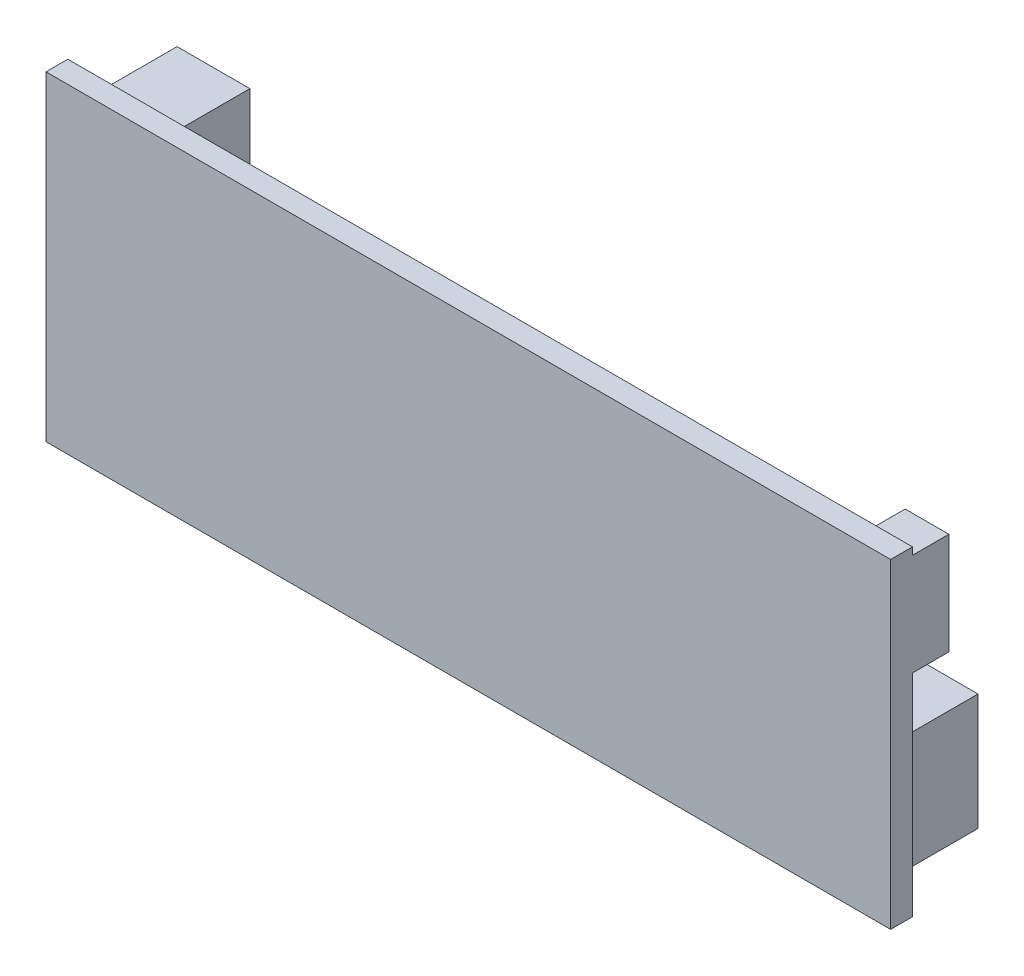
ISO-10303-21;
HEADER;
FILE_DESCRIPTION(('STEP AP214'),'2;1');
FILE_NAME('part.step','',(''),(''),'','','');
FILE_SCHEMA(('AUTOMOTIVE_DESIGN { 1 0 10303 214 1 1 1 1 }'));
ENDSEC;
DATA;
#1=APPLICATION_CONTEXT('core data for automotive mechanical design processes');
#2=APPLICATION_PROTOCOL_DEFINITION('international standard','automotive_design',2000,#1);
#3=PRODUCT_CONTEXT('',#1,'mechanical');
#4=PRODUCT('Part','Part','',(#3));
#5=PRODUCT_RELATED_PRODUCT_CATEGORY('part','',(#4));
#6=PRODUCT_DEFINITION_FORMATION('','',#4);
#7=PRODUCT_DEFINITION_CONTEXT('part definition',#1,'design');
#8=PRODUCT_DEFINITION('design','',#6,#7);
#9=PRODUCT_DEFINITION_SHAPE('','',#8);
#10=(LENGTH_UNIT() NAMED_UNIT(*) SI_UNIT(.MILLI.,.METRE.));
#11=(NAMED_UNIT(*) PLANE_ANGLE_UNIT() SI_UNIT($,.RADIAN.));
#12=(NAMED_UNIT(*) SI_UNIT($,.STERADIAN.) SOLID_ANGLE_UNIT());
#13=UNCERTAINTY_MEASURE_WITH_UNIT(LENGTH_MEASURE(1.E-05),#10,'distance_accuracy_value','');
#14=(GEOMETRIC_REPRESENTATION_CONTEXT(3) GLOBAL_UNCERTAINTY_ASSIGNED_CONTEXT((#13)) GLOBAL_UNIT_ASSIGNED_CONTEXT((#10,
#11,#12)) REPRESENTATION_CONTEXT('',''));
#15=CARTESIAN_POINT('',(0.,0.,0.));
#16=DIRECTION('',(0.,0.,1.));
#17=DIRECTION('',(1.,0.,0.));
#18=AXIS2_PLACEMENT_3D('',#15,#16,#17);
#19=CARTESIAN_POINT('',(0.,0.,0.));
#20=DIRECTION('',(0.,0.,-1.));
#21=DIRECTION('',(-1.,0.,0.));
#22=AXIS2_PLACEMENT_3D('',#19,#20,#21);
#23=PLANE('',#22);
#24=DIRECTION('',(1.,0.,0.));
#25=VECTOR('',#24,1.);
#26=CARTESIAN_POINT('',(-17.781512605042,20.5,0.));
#27=LINE('',#26,#25);
#28=CARTESIAN_POINT('',(-17.781512605042,20.5,0.));
#29=VERTEX_POINT('',#28);
#30=CARTESIAN_POINT('',(-12.781512605042,20.5,0.));
#31=VERTEX_POINT('',#30);
#32=EDGE_CURVE('E276',#29,#31,#27,.T.);
#33=ORIENTED_EDGE('',*,*,#32,.F.);
#34=DIRECTION('',(0.,1.,0.));
#35=VECTOR('',#34,1.);
#36=CARTESIAN_POINT('',(-17.781512605042,20.5,0.));
#37=LINE('',#36,#35);
#38=CARTESIAN_POINT('',(-17.781512605042,15.5,0.));
#39=VERTEX_POINT('',#38);
#40=EDGE_CURVE('E273',#39,#29,#37,.T.);
#41=ORIENTED_EDGE('',*,*,#40,.F.);
#42=DIRECTION('',(-1.,0.,0.));
#43=VECTOR('',#42,1.);
#44=CARTESIAN_POINT('',(-17.781512605042,15.5,0.));
#45=LINE('',#44,#43);
#46=CARTESIAN_POINT('',(-12.781512605042,15.5,0.));
#47=VERTEX_POINT('',#46);
#48=EDGE_CURVE('E281',#47,#39,#45,.T.);
#49=ORIENTED_EDGE('',*,*,#48,.F.);
#50=DIRECTION('',(0.,-1.,0.));
#51=VECTOR('',#50,1.);
#52=CARTESIAN_POINT('',(-12.781512605042,20.5,0.));
#53=LINE('',#52,#51);
#54=EDGE_CURVE('E278',#31,#47,#53,.T.);
#55=ORIENTED_EDGE('',*,*,#54,.F.);
#56=EDGE_LOOP('',(#33,#41,#49,#55));
#57=FACE_BOUND('',#56,.T.);
#58=DIRECTION('',(-1.,0.,0.));
#59=VECTOR('',#58,1.);
#60=CARTESIAN_POINT('',(37.218487394958,1.5,0.));
#61=LINE('',#60,#59);
#62=CARTESIAN_POINT('',(37.218487394958,1.5,0.));
#63=VERTEX_POINT('',#62);
#64=CARTESIAN_POINT('',(29.218487394958,1.5,0.));
#65=VERTEX_POINT('',#64);
#66=EDGE_CURVE('E237',#63,#65,#61,.T.);
#67=ORIENTED_EDGE('',*,*,#66,.F.);
#68=DIRECTION('',(0.,-1.,0.));
#69=VECTOR('',#68,1.);
#70=CARTESIAN_POINT('',(37.218487394958,1.5,0.));
#71=LINE('',#70,#69);
#72=CARTESIAN_POINT('',(37.218487394958,9.5,0.));
#73=VERTEX_POINT('',#72);
#74=EDGE_CURVE('E235',#73,#63,#71,.T.);
#75=ORIENTED_EDGE('',*,*,#74,.F.);
#76=DIRECTION('',(1.,0.,0.));
#77=VECTOR('',#76,1.);
#78=CARTESIAN_POINT('',(37.218487394958,9.5,0.));
#79=LINE('',#78,#77);
#80=CARTESIAN_POINT('',(29.218487394958,9.5,0.));
#81=VERTEX_POINT('',#80);
#82=EDGE_CURVE('E174',#81,#73,#79,.T.);
#83=ORIENTED_EDGE('',*,*,#82,.F.);
#84=DIRECTION('',(0.,1.,0.));
#85=VECTOR('',#84,1.);
#86=CARTESIAN_POINT('',(29.218487394958,1.5,0.));
#87=LINE('',#86,#85);
#88=EDGE_CURVE('E239',#65,#81,#87,.T.);
#89=ORIENTED_EDGE('',*,*,#88,.F.);
#90=EDGE_LOOP('',(#67,#75,#83,#89));
#91=FACE_BOUND('',#90,.T.);
#92=DIRECTION('',(0.,-1.,0.));
#93=VECTOR('',#92,1.);
#94=CARTESIAN_POINT('',(-19.281512605042,22.,0.));
#95=LINE('',#94,#93);
#96=CARTESIAN_POINT('',(-19.281512605042,3.09786204051446,0.));
#97=VERTEX_POINT('',#96);
#98=CARTESIAN_POINT('',(-19.281512605042,0.,0.));
#99=VERTEX_POINT('',#98);
#100=EDGE_CURVE('E307',#97,#99,#95,.T.);
#101=ORIENTED_EDGE('',*,*,#100,.F.);
#102=DIRECTION('',(-1.,0.,0.));
#103=VECTOR('',#102,1.);
#104=CARTESIAN_POINT('',(-17.781512605042,3.09786204051446,0.));
#105=LINE('',#104,#103);
#106=CARTESIAN_POINT('',(-17.781512605042,3.09786204051446,0.));
#107=VERTEX_POINT('',#106);
#108=EDGE_CURVE('E223',#107,#97,#105,.T.);
#109=ORIENTED_EDGE('',*,*,#108,.F.);
#110=DIRECTION('',(0.,-1.,0.));
#111=VECTOR('',#110,1.);
#112=CARTESIAN_POINT('',(-17.781512605042,7.9,0.));
#113=LINE('',#112,#111);
#114=CARTESIAN_POINT('',(-17.781512605042,7.9,0.));
#115=VERTEX_POINT('',#114);
#116=EDGE_CURVE('E220',#115,#107,#113,.T.);
#117=ORIENTED_EDGE('',*,*,#116,.F.);
#118=DIRECTION('',(1.,0.,0.));
#119=VECTOR('',#118,1.);
#120=CARTESIAN_POINT('',(-17.781512605042,7.9,0.));
#121=LINE('',#120,#119);
#122=CARTESIAN_POINT('',(-19.281512605042,7.9,0.));
#123=VERTEX_POINT('',#122);
#124=EDGE_CURVE('E225',#123,#115,#121,.T.);
#125=ORIENTED_EDGE('',*,*,#124,.F.);
#126=CARTESIAN_POINT('',(-19.281512605042,22.,0.));
#127=VERTEX_POINT('',#126);
#128=EDGE_CURVE('E308',#127,#123,#95,.T.);
#129=ORIENTED_EDGE('',*,*,#128,.F.);
#130=DIRECTION('',(-1.,0.,0.));
#131=VECTOR('',#130,1.);
#132=CARTESIAN_POINT('',(-19.281512605042,22.,0.));
#133=LINE('',#132,#131);
#134=CARTESIAN_POINT('',(38.718487394958,22.,0.));
#135=VERTEX_POINT('',#134);
#136=EDGE_CURVE('E293',#135,#127,#133,.T.);
#137=ORIENTED_EDGE('',*,*,#136,.F.);
#138=DIRECTION('',(0.,1.,0.));
#139=VECTOR('',#138,1.);
#140=CARTESIAN_POINT('',(38.718487394958,22.,0.));
#141=LINE('',#140,#139);
#142=CARTESIAN_POINT('',(38.718487394958,21.5,0.));
#143=VERTEX_POINT('',#142);
#144=EDGE_CURVE('E313',#143,#135,#141,.T.);
#145=ORIENTED_EDGE('',*,*,#144,.F.);
#146=DIRECTION('',(1.,0.,0.));
#147=VECTOR('',#146,1.);
#148=CARTESIAN_POINT('',(38.718487394958,21.5,0.));
#149=LINE('',#148,#147);
#150=CARTESIAN_POINT('',(35.718487394958,21.5,0.));
#151=VERTEX_POINT('',#150);
#152=EDGE_CURVE('E252',#151,#143,#149,.T.);
#153=ORIENTED_EDGE('',*,*,#152,.F.);
#154=DIRECTION('',(0.,1.,0.));
#155=VECTOR('',#154,1.);
#156=CARTESIAN_POINT('',(35.718487394958,21.5,0.));
#157=LINE('',#156,#155);
#158=CARTESIAN_POINT('',(35.718487394958,14.5,0.));
#159=VERTEX_POINT('',#158);
#160=EDGE_CURVE('E260',#159,#151,#157,.T.);
#161=ORIENTED_EDGE('',*,*,#160,.F.);
#162=DIRECTION('',(-1.,0.,0.));
#163=VECTOR('',#162,1.);
#164=CARTESIAN_POINT('',(38.718487394958,14.5,0.));
#165=LINE('',#164,#163);
#166=CARTESIAN_POINT('',(38.718487394958,14.5,0.));
#167=VERTEX_POINT('',#166);
#168=EDGE_CURVE('E247',#167,#159,#165,.T.);
#169=ORIENTED_EDGE('',*,*,#168,.F.);
#170=CARTESIAN_POINT('',(38.718487394958,0.,0.));
#171=VERTEX_POINT('',#170);
#172=EDGE_CURVE('E298',#171,#167,#141,.T.);
#173=ORIENTED_EDGE('',*,*,#172,.F.);
#174=DIRECTION('',(1.,0.,0.));
#175=VECTOR('',#174,1.);
#176=CARTESIAN_POINT('',(38.718487394958,0.,0.));
#177=LINE('',#176,#175);
#178=EDGE_CURVE('E311',#99,#171,#177,.T.);
#179=ORIENTED_EDGE('',*,*,#178,.F.);
#180=EDGE_LOOP('',(#101,#109,#117,#125,#129,#137,#145,#153,#161,#169,#173,#179));
#181=FACE_BOUND('',#180,.T.);
#182=ADVANCED_FACE('F33',(#57,#91,#181),#23,.T.);
#183=CARTESIAN_POINT('',(-19.281512605042,22.,1.5));
#184=DIRECTION('',(0.,-1.,0.));
#185=DIRECTION('',(0.,0.,-1.));
#186=AXIS2_PLACEMENT_3D('',#183,#184,#185);
#187=PLANE('',#186);
#188=ORIENTED_EDGE('',*,*,#136,.T.);
#189=DIRECTION('',(0.,0.,-1.));
#190=VECTOR('',#189,1.);
#191=CARTESIAN_POINT('',(-19.281512605042,22.,1.5));
#192=LINE('',#191,#190);
#193=CARTESIAN_POINT('',(-19.281512605042,22.,1.5));
#194=VERTEX_POINT('',#193);
#195=EDGE_CURVE('E11',#194,#127,#192,.T.);
#196=ORIENTED_EDGE('',*,*,#195,.F.);
#197=DIRECTION('',(-1.,0.,0.));
#198=VECTOR('',#197,1.);
#199=CARTESIAN_POINT('',(-19.281512605042,22.,1.5));
#200=LINE('',#199,#198);
#201=CARTESIAN_POINT('',(38.718487394958,22.,1.5));
#202=VERTEX_POINT('',#201);
#203=EDGE_CURVE('E294',#202,#194,#200,.T.);
#204=ORIENTED_EDGE('',*,*,#203,.F.);
#205=DIRECTION('',(0.,0.,-1.));
#206=VECTOR('',#205,1.);
#207=CARTESIAN_POINT('',(38.718487394958,22.,1.5));
#208=LINE('',#207,#206);
#209=EDGE_CURVE('E304',#202,#135,#208,.T.);
#210=ORIENTED_EDGE('',*,*,#209,.T.);
#211=EDGE_LOOP('',(#188,#196,#204,#210));
#212=FACE_BOUND('',#211,.T.);
#213=ADVANCED_FACE('F35',(#212),#187,.F.);
#214=CARTESIAN_POINT('',(-19.281512605042,22.,1.5));
#215=DIRECTION('',(1.,0.,0.));
#216=DIRECTION('',(0.,0.,-1.));
#217=AXIS2_PLACEMENT_3D('',#214,#215,#216);
#218=PLANE('',#217);
#219=ORIENTED_EDGE('',*,*,#128,.T.);
#220=DIRECTION('',(0.,0.,1.));
#221=VECTOR('',#220,1.);
#222=CARTESIAN_POINT('',(-19.281512605042,7.9,-2.5));
#223=LINE('',#222,#221);
#224=CARTESIAN_POINT('',(-19.281512605042,7.9,-6.));
#225=VERTEX_POINT('',#224);
#226=EDGE_CURVE('E230',#225,#123,#223,.T.);
#227=ORIENTED_EDGE('',*,*,#226,.F.);
#228=DIRECTION('',(0.,1.,0.));
#229=VECTOR('',#228,1.);
#230=CARTESIAN_POINT('',(-19.281512605042,3.09786204051446,-6.));
#231=LINE('',#230,#229);
#232=CARTESIAN_POINT('',(-19.281512605042,3.09786204051446,-6.));
#233=VERTEX_POINT('',#232);
#234=EDGE_CURVE('E217',#233,#225,#231,.T.);
#235=ORIENTED_EDGE('',*,*,#234,.F.);
#236=DIRECTION('',(0.,0.,1.));
#237=VECTOR('',#236,1.);
#238=CARTESIAN_POINT('',(-19.281512605042,3.09786204051446,-2.5));
#239=LINE('',#238,#237);
#240=EDGE_CURVE('E48',#233,#97,#239,.T.);
#241=ORIENTED_EDGE('',*,*,#240,.T.);
#242=ORIENTED_EDGE('',*,*,#100,.T.);
#243=DIRECTION('',(0.,0.,-1.));
#244=VECTOR('',#243,1.);
#245=CARTESIAN_POINT('',(-19.281512605042,0.,1.5));
#246=LINE('',#245,#244);
#247=CARTESIAN_POINT('',(-19.281512605042,0.,1.5));
#248=VERTEX_POINT('',#247);
#249=EDGE_CURVE('E41',#248,#99,#246,.T.);
#250=ORIENTED_EDGE('',*,*,#249,.F.);
#251=DIRECTION('',(0.,-1.,0.));
#252=VECTOR('',#251,1.);
#253=CARTESIAN_POINT('',(-19.281512605042,22.,1.5));
#254=LINE('',#253,#252);
#255=EDGE_CURVE('E297',#194,#248,#254,.T.);
#256=ORIENTED_EDGE('',*,*,#255,.F.);
#257=ORIENTED_EDGE('',*,*,#195,.T.);
#258=EDGE_LOOP('',(#219,#227,#235,#241,#242,#250,#256,#257));
#259=FACE_BOUND('',#258,.T.);
#260=ADVANCED_FACE('F343',(#259),#218,.F.);
#261=CARTESIAN_POINT('',(38.718487394958,0.,1.5));
#262=DIRECTION('',(0.,1.,0.));
#263=DIRECTION('',(0.,0.,1.));
#264=AXIS2_PLACEMENT_3D('',#261,#262,#263);
#265=PLANE('',#264);
#266=ORIENTED_EDGE('',*,*,#178,.T.);
#267=DIRECTION('',(0.,0.,-1.));
#268=VECTOR('',#267,1.);
#269=CARTESIAN_POINT('',(38.718487394958,0.,1.5));
#270=LINE('',#269,#268);
#271=CARTESIAN_POINT('',(38.718487394958,0.,1.5));
#272=VERTEX_POINT('',#271);
#273=EDGE_CURVE('E318',#272,#171,#270,.T.);
#274=ORIENTED_EDGE('',*,*,#273,.F.);
#275=DIRECTION('',(1.,0.,0.));
#276=VECTOR('',#275,1.);
#277=CARTESIAN_POINT('',(38.718487394958,0.,1.5));
#278=LINE('',#277,#276);
#279=EDGE_CURVE('E300',#248,#272,#278,.T.);
#280=ORIENTED_EDGE('',*,*,#279,.F.);
#281=ORIENTED_EDGE('',*,*,#249,.T.);
#282=EDGE_LOOP('',(#266,#274,#280,#281));
#283=FACE_BOUND('',#282,.T.);
#284=ADVANCED_FACE('F325',(#283),#265,.F.);
#285=CARTESIAN_POINT('',(38.718487394958,22.,1.5));
#286=DIRECTION('',(-1.,0.,0.));
#287=DIRECTION('',(0.,0.,1.));
#288=AXIS2_PLACEMENT_3D('',#285,#286,#287);
#289=PLANE('',#288);
#290=ORIENTED_EDGE('',*,*,#172,.T.);
#291=DIRECTION('',(0.,0.,1.));
#292=VECTOR('',#291,1.);
#293=CARTESIAN_POINT('',(38.718487394958,14.5,-2.5));
#294=LINE('',#293,#292);
#295=CARTESIAN_POINT('',(38.718487394958,14.5,-2.5));
#296=VERTEX_POINT('',#295);
#297=EDGE_CURVE('E271',#296,#167,#294,.T.);
#298=ORIENTED_EDGE('',*,*,#297,.F.);
#299=DIRECTION('',(0.,-1.,0.));
#300=VECTOR('',#299,1.);
#301=CARTESIAN_POINT('',(38.718487394958,21.5,-2.5));
#302=LINE('',#301,#300);
#303=CARTESIAN_POINT('',(38.718487394958,21.5,-2.5));
#304=VERTEX_POINT('',#303);
#305=EDGE_CURVE('E248',#304,#296,#302,.T.);
#306=ORIENTED_EDGE('',*,*,#305,.F.);
#307=DIRECTION('',(0.,0.,1.));
#308=VECTOR('',#307,1.);
#309=CARTESIAN_POINT('',(38.718487394958,21.5,-2.5));
#310=LINE('',#309,#308);
#311=EDGE_CURVE('E258',#304,#143,#310,.T.);
#312=ORIENTED_EDGE('',*,*,#311,.T.);
#313=ORIENTED_EDGE('',*,*,#144,.T.);
#314=ORIENTED_EDGE('',*,*,#209,.F.);
#315=DIRECTION('',(0.,1.,0.));
#316=VECTOR('',#315,1.);
#317=CARTESIAN_POINT('',(38.718487394958,22.,1.5));
#318=LINE('',#317,#316);
#319=EDGE_CURVE('E302',#272,#202,#318,.T.);
#320=ORIENTED_EDGE('',*,*,#319,.F.);
#321=ORIENTED_EDGE('',*,*,#273,.T.);
#322=EDGE_LOOP('',(#290,#298,#306,#312,#313,#314,#320,#321));
#323=FACE_BOUND('',#322,.T.);
#324=ADVANCED_FACE('F335',(#323),#289,.F.);
#325=CARTESIAN_POINT('',(0.,0.,1.5));
#326=DIRECTION('',(0.,0.,-1.));
#327=DIRECTION('',(-1.,0.,0.));
#328=AXIS2_PLACEMENT_3D('',#325,#326,#327);
#329=PLANE('',#328);
#330=ORIENTED_EDGE('',*,*,#203,.T.);
#331=ORIENTED_EDGE('',*,*,#255,.T.);
#332=ORIENTED_EDGE('',*,*,#279,.T.);
#333=ORIENTED_EDGE('',*,*,#319,.T.);
#334=EDGE_LOOP('',(#330,#331,#332,#333));
#335=FACE_BOUND('',#334,.T.);
#336=ADVANCED_FACE('F341',(#335),#329,.F.);
#337=CARTESIAN_POINT('',(-17.781512605042,20.5,-2.5));
#338=DIRECTION('',(1.,0.,0.));
#339=DIRECTION('',(0.,0.,-1.));
#340=AXIS2_PLACEMENT_3D('',#337,#338,#339);
#341=PLANE('',#340);
#342=ORIENTED_EDGE('',*,*,#40,.T.);
#343=DIRECTION('',(0.,0.,1.));
#344=VECTOR('',#343,1.);
#345=CARTESIAN_POINT('',(-17.781512605042,20.5,-2.5));
#346=LINE('',#345,#344);
#347=CARTESIAN_POINT('',(-17.781512605042,20.5,-6.));
#348=VERTEX_POINT('',#347);
#349=EDGE_CURVE('E291',#348,#29,#346,.T.);
#350=ORIENTED_EDGE('',*,*,#349,.F.);
#351=DIRECTION('',(0.,1.,0.));
#352=VECTOR('',#351,1.);
#353=CARTESIAN_POINT('',(-17.781512605042,15.5,-6.));
#354=LINE('',#353,#352);
#355=CARTESIAN_POINT('',(-17.781512605042,15.5,-6.));
#356=VERTEX_POINT('',#355);
#357=EDGE_CURVE('E199',#356,#348,#354,.T.);
#358=ORIENTED_EDGE('',*,*,#357,.F.);
#359=DIRECTION('',(0.,0.,1.));
#360=VECTOR('',#359,1.);
#361=CARTESIAN_POINT('',(-17.781512605042,15.5,-2.5));
#362=LINE('',#361,#360);
#363=EDGE_CURVE('E283',#356,#39,#362,.T.);
#364=ORIENTED_EDGE('',*,*,#363,.T.);
#365=EDGE_LOOP('',(#342,#350,#358,#364));
#366=FACE_BOUND('',#365,.T.);
#367=ADVANCED_FACE('F395',(#366),#341,.F.);
#368=CARTESIAN_POINT('',(-17.781512605042,20.5,-2.5));
#369=DIRECTION('',(0.,-1.,0.));
#370=DIRECTION('',(0.,0.,-1.));
#371=AXIS2_PLACEMENT_3D('',#368,#369,#370);
#372=PLANE('',#371);
#373=ORIENTED_EDGE('',*,*,#32,.T.);
#374=DIRECTION('',(0.,0.,1.));
#375=VECTOR('',#374,1.);
#376=CARTESIAN_POINT('',(-12.781512605042,20.5,-2.5));
#377=LINE('',#376,#375);
#378=CARTESIAN_POINT('',(-12.781512605042,20.5,-6.));
#379=VERTEX_POINT('',#378);
#380=EDGE_CURVE('E288',#379,#31,#377,.T.);
#381=ORIENTED_EDGE('',*,*,#380,.F.);
#382=DIRECTION('',(1.,0.,0.));
#383=VECTOR('',#382,1.);
#384=CARTESIAN_POINT('',(-17.781512605042,20.5,-6.));
#385=LINE('',#384,#383);
#386=EDGE_CURVE('E202',#348,#379,#385,.T.);
#387=ORIENTED_EDGE('',*,*,#386,.F.);
#388=ORIENTED_EDGE('',*,*,#349,.T.);
#389=EDGE_LOOP('',(#373,#381,#387,#388));
#390=FACE_BOUND('',#389,.T.);
#391=ADVANCED_FACE('F398',(#390),#372,.F.);
#392=CARTESIAN_POINT('',(-12.781512605042,20.5,-2.5));
#393=DIRECTION('',(-1.,0.,0.));
#394=DIRECTION('',(0.,0.,1.));
#395=AXIS2_PLACEMENT_3D('',#392,#393,#394);
#396=PLANE('',#395);
#397=ORIENTED_EDGE('',*,*,#54,.T.);
#398=DIRECTION('',(0.,0.,1.));
#399=VECTOR('',#398,1.);
#400=CARTESIAN_POINT('',(-12.781512605042,15.5,-2.5));
#401=LINE('',#400,#399);
#402=CARTESIAN_POINT('',(-12.781512605042,15.5,-6.));
#403=VERTEX_POINT('',#402);
#404=EDGE_CURVE('E286',#403,#47,#401,.T.);
#405=ORIENTED_EDGE('',*,*,#404,.F.);
#406=DIRECTION('',(0.,-1.,0.));
#407=VECTOR('',#406,1.);
#408=CARTESIAN_POINT('',(-12.781512605042,20.5,-6.));
#409=LINE('',#408,#407);
#410=EDGE_CURVE('E205',#379,#403,#409,.T.);
#411=ORIENTED_EDGE('',*,*,#410,.F.);
#412=ORIENTED_EDGE('',*,*,#380,.T.);
#413=EDGE_LOOP('',(#397,#405,#411,#412));
#414=FACE_BOUND('',#413,.T.);
#415=ADVANCED_FACE('F405',(#414),#396,.F.);
#416=CARTESIAN_POINT('',(-17.781512605042,15.5,-2.5));
#417=DIRECTION('',(0.,1.,0.));
#418=DIRECTION('',(0.,0.,1.));
#419=AXIS2_PLACEMENT_3D('',#416,#417,#418);
#420=PLANE('',#419);
#421=ORIENTED_EDGE('',*,*,#48,.T.);
#422=ORIENTED_EDGE('',*,*,#363,.F.);
#423=DIRECTION('',(-1.,0.,0.));
#424=VECTOR('',#423,1.);
#425=CARTESIAN_POINT('',(-12.781512605042,15.5,-6.));
#426=LINE('',#425,#424);
#427=EDGE_CURVE('E196',#403,#356,#426,.T.);
#428=ORIENTED_EDGE('',*,*,#427,.F.);
#429=ORIENTED_EDGE('',*,*,#404,.T.);
#430=EDGE_LOOP('',(#421,#422,#428,#429));
#431=FACE_BOUND('',#430,.T.);
#432=ADVANCED_FACE('F413',(#431),#420,.F.);
#433=CARTESIAN_POINT('',(38.718487394958,14.5,-2.5));
#434=DIRECTION('',(0.,1.,0.));
#435=DIRECTION('',(0.,0.,1.));
#436=AXIS2_PLACEMENT_3D('',#433,#434,#435);
#437=PLANE('',#436);
#438=ORIENTED_EDGE('',*,*,#168,.T.);
#439=DIRECTION('',(0.,0.,1.));
#440=VECTOR('',#439,1.);
#441=CARTESIAN_POINT('',(35.718487394958,14.5,-2.5));
#442=LINE('',#441,#440);
#443=CARTESIAN_POINT('',(35.718487394958,14.5,-2.5));
#444=VERTEX_POINT('',#443);
#445=EDGE_CURVE('E268',#444,#159,#442,.T.);
#446=ORIENTED_EDGE('',*,*,#445,.F.);
#447=DIRECTION('',(-1.,0.,0.));
#448=VECTOR('',#447,1.);
#449=CARTESIAN_POINT('',(38.718487394958,14.5,-2.5));
#450=LINE('',#449,#448);
#451=EDGE_CURVE('E251',#296,#444,#450,.T.);
#452=ORIENTED_EDGE('',*,*,#451,.F.);
#453=ORIENTED_EDGE('',*,*,#297,.T.);
#454=EDGE_LOOP('',(#438,#446,#452,#453));
#455=FACE_BOUND('',#454,.T.);
#456=ADVANCED_FACE('F421',(#455),#437,.F.);
#457=CARTESIAN_POINT('',(35.718487394958,21.5,-2.5));
#458=DIRECTION('',(1.,0.,0.));
#459=DIRECTION('',(0.,0.,-1.));
#460=AXIS2_PLACEMENT_3D('',#457,#458,#459);
#461=PLANE('',#460);
#462=ORIENTED_EDGE('',*,*,#160,.T.);
#463=DIRECTION('',(0.,0.,1.));
#464=VECTOR('',#463,1.);
#465=CARTESIAN_POINT('',(35.718487394958,21.5,-2.5));
#466=LINE('',#465,#464);
#467=CARTESIAN_POINT('',(35.718487394958,21.5,-2.5));
#468=VERTEX_POINT('',#467);
#469=EDGE_CURVE('E265',#468,#151,#466,.T.);
#470=ORIENTED_EDGE('',*,*,#469,.F.);
#471=DIRECTION('',(0.,1.,0.));
#472=VECTOR('',#471,1.);
#473=CARTESIAN_POINT('',(35.718487394958,21.5,-2.5));
#474=LINE('',#473,#472);
#475=EDGE_CURVE('E254',#444,#468,#474,.T.);
#476=ORIENTED_EDGE('',*,*,#475,.F.);
#477=ORIENTED_EDGE('',*,*,#445,.T.);
#478=EDGE_LOOP('',(#462,#470,#476,#477));
#479=FACE_BOUND('',#478,.T.);
#480=ADVANCED_FACE('F572',(#479),#461,.F.);
#481=CARTESIAN_POINT('',(38.718487394958,21.5,-2.5));
#482=DIRECTION('',(0.,-1.,0.));
#483=DIRECTION('',(0.,0.,-1.));
#484=AXIS2_PLACEMENT_3D('',#481,#482,#483);
#485=PLANE('',#484);
#486=ORIENTED_EDGE('',*,*,#152,.T.);
#487=ORIENTED_EDGE('',*,*,#311,.F.);
#488=DIRECTION('',(1.,0.,0.));
#489=VECTOR('',#488,1.);
#490=CARTESIAN_POINT('',(38.718487394958,21.5,-2.5));
#491=LINE('',#490,#489);
#492=EDGE_CURVE('E256',#468,#304,#491,.T.);
#493=ORIENTED_EDGE('',*,*,#492,.F.);
#494=ORIENTED_EDGE('',*,*,#469,.T.);
#495=EDGE_LOOP('',(#486,#487,#493,#494));
#496=FACE_BOUND('',#495,.T.);
#497=ADVANCED_FACE('F564',(#496),#485,.F.);
#498=CARTESIAN_POINT('',(0.,0.,-2.5));
#499=DIRECTION('',(0.,0.,-1.));
#500=DIRECTION('',(-1.,0.,0.));
#501=AXIS2_PLACEMENT_3D('',#498,#499,#500);
#502=PLANE('',#501);
#503=ORIENTED_EDGE('',*,*,#305,.T.);
#504=ORIENTED_EDGE('',*,*,#451,.T.);
#505=ORIENTED_EDGE('',*,*,#475,.T.);
#506=ORIENTED_EDGE('',*,*,#492,.T.);
#507=EDGE_LOOP('',(#503,#504,#505,#506));
#508=FACE_BOUND('',#507,.T.);
#509=ADVANCED_FACE('F392',(#508),#502,.T.);
#510=CARTESIAN_POINT('',(37.218487394958,1.5,-2.5));
#511=DIRECTION('',(-1.,0.,0.));
#512=DIRECTION('',(0.,0.,1.));
#513=AXIS2_PLACEMENT_3D('',#510,#511,#512);
#514=PLANE('',#513);
#515=ORIENTED_EDGE('',*,*,#74,.T.);
#516=DIRECTION('',(0.,0.,1.));
#517=VECTOR('',#516,1.);
#518=CARTESIAN_POINT('',(37.218487394958,1.5,-2.5));
#519=LINE('',#518,#517);
#520=CARTESIAN_POINT('',(37.218487394958,1.5,-6.));
#521=VERTEX_POINT('',#520);
#522=EDGE_CURVE('E182',#521,#63,#519,.T.);
#523=ORIENTED_EDGE('',*,*,#522,.F.);
#524=DIRECTION('',(0.,-1.,0.));
#525=VECTOR('',#524,1.);
#526=CARTESIAN_POINT('',(37.218487394958,9.5,-6.));
#527=LINE('',#526,#525);
#528=CARTESIAN_POINT('',(37.218487394958,9.5,-6.));
#529=VERTEX_POINT('',#528);
#530=EDGE_CURVE('E180',#529,#521,#527,.T.);
#531=ORIENTED_EDGE('',*,*,#530,.F.);
#532=DIRECTION('',(0.,0.,1.));
#533=VECTOR('',#532,1.);
#534=CARTESIAN_POINT('',(37.218487394958,9.5,-2.5));
#535=LINE('',#534,#533);
#536=EDGE_CURVE('E168',#529,#73,#535,.T.);
#537=ORIENTED_EDGE('',*,*,#536,.T.);
#538=EDGE_LOOP('',(#515,#523,#531,#537));
#539=FACE_BOUND('',#538,.T.);
#540=ADVANCED_FACE('F181',(#539),#514,.F.);
#541=CARTESIAN_POINT('',(37.218487394958,1.5,-2.5));
#542=DIRECTION('',(0.,1.,0.));
#543=DIRECTION('',(0.,0.,1.));
#544=AXIS2_PLACEMENT_3D('',#541,#542,#543);
#545=PLANE('',#544);
#546=ORIENTED_EDGE('',*,*,#66,.T.);
#547=DIRECTION('',(0.,0.,1.));
#548=VECTOR('',#547,1.);
#549=CARTESIAN_POINT('',(29.218487394958,1.5,-2.5));
#550=LINE('',#549,#548);
#551=CARTESIAN_POINT('',(29.218487394958,1.5,-6.));
#552=VERTEX_POINT('',#551);
#553=EDGE_CURVE('E243',#552,#65,#550,.T.);
#554=ORIENTED_EDGE('',*,*,#553,.F.);
#555=DIRECTION('',(-1.,0.,0.));
#556=VECTOR('',#555,1.);
#557=CARTESIAN_POINT('',(37.218487394958,1.5,-6.));
#558=LINE('',#557,#556);
#559=EDGE_CURVE('E186',#521,#552,#558,.T.);
#560=ORIENTED_EDGE('',*,*,#559,.F.);
#561=ORIENTED_EDGE('',*,*,#522,.T.);
#562=EDGE_LOOP('',(#546,#554,#560,#561));
#563=FACE_BOUND('',#562,.T.);
#564=ADVANCED_FACE('F429',(#563),#545,.F.);
#565=CARTESIAN_POINT('',(29.218487394958,1.5,-2.5));
#566=DIRECTION('',(1.,0.,0.));
#567=DIRECTION('',(0.,0.,-1.));
#568=AXIS2_PLACEMENT_3D('',#565,#566,#567);
#569=PLANE('',#568);
#570=ORIENTED_EDGE('',*,*,#88,.T.);
#571=DIRECTION('',(0.,0.,1.));
#572=VECTOR('',#571,1.);
#573=CARTESIAN_POINT('',(29.218487394958,9.5,-2.5));
#574=LINE('',#573,#572);
#575=CARTESIAN_POINT('',(29.218487394958,9.5,-6.));
#576=VERTEX_POINT('',#575);
#577=EDGE_CURVE('E56',#576,#81,#574,.T.);
#578=ORIENTED_EDGE('',*,*,#577,.F.);
#579=DIRECTION('',(0.,1.,0.));
#580=VECTOR('',#579,1.);
#581=CARTESIAN_POINT('',(29.218487394958,1.5,-6.));
#582=LINE('',#581,#580);
#583=EDGE_CURVE('E191',#552,#576,#582,.T.);
#584=ORIENTED_EDGE('',*,*,#583,.F.);
#585=ORIENTED_EDGE('',*,*,#553,.T.);
#586=EDGE_LOOP('',(#570,#578,#584,#585));
#587=FACE_BOUND('',#586,.T.);
#588=ADVANCED_FACE('F436',(#587),#569,.F.);
#589=CARTESIAN_POINT('',(37.218487394958,9.5,-2.5));
#590=DIRECTION('',(0.,-1.,0.));
#591=DIRECTION('',(0.,0.,-1.));
#592=AXIS2_PLACEMENT_3D('',#589,#590,#591);
#593=PLANE('',#592);
#594=ORIENTED_EDGE('',*,*,#82,.T.);
#595=ORIENTED_EDGE('',*,*,#536,.F.);
#596=DIRECTION('',(1.,0.,0.));
#597=VECTOR('',#596,1.);
#598=CARTESIAN_POINT('',(29.218487394958,9.5,-6.));
#599=LINE('',#598,#597);
#600=EDGE_CURVE('E172',#576,#529,#599,.T.);
#601=ORIENTED_EDGE('',*,*,#600,.F.);
#602=ORIENTED_EDGE('',*,*,#577,.T.);
#603=EDGE_LOOP('',(#594,#595,#601,#602));
#604=FACE_BOUND('',#603,.T.);
#605=ADVANCED_FACE('F170',(#604),#593,.F.);
#606=CARTESIAN_POINT('',(-17.781512605042,7.9,-2.5));
#607=DIRECTION('',(-1.,0.,0.));
#608=DIRECTION('',(0.,0.,1.));
#609=AXIS2_PLACEMENT_3D('',#606,#607,#608);
#610=PLANE('',#609);
#611=ORIENTED_EDGE('',*,*,#116,.T.);
#612=DIRECTION('',(0.,0.,1.));
#613=VECTOR('',#612,1.);
#614=CARTESIAN_POINT('',(-17.781512605042,3.09786204051446,-2.5));
#615=LINE('',#614,#613);
#616=CARTESIAN_POINT('',(-17.781512605042,3.09786204051446,-6.));
#617=VERTEX_POINT('',#616);
#618=EDGE_CURVE('E233',#617,#107,#615,.T.);
#619=ORIENTED_EDGE('',*,*,#618,.F.);
#620=DIRECTION('',(0.,-1.,0.));
#621=VECTOR('',#620,1.);
#622=CARTESIAN_POINT('',(-17.781512605042,7.9,-6.));
#623=LINE('',#622,#621);
#624=CARTESIAN_POINT('',(-17.781512605042,7.9,-6.));
#625=VERTEX_POINT('',#624);
#626=EDGE_CURVE('E211',#625,#617,#623,.T.);
#627=ORIENTED_EDGE('',*,*,#626,.F.);
#628=DIRECTION('',(0.,0.,1.));
#629=VECTOR('',#628,1.);
#630=CARTESIAN_POINT('',(-17.781512605042,7.9,-2.5));
#631=LINE('',#630,#629);
#632=EDGE_CURVE('E227',#625,#115,#631,.T.);
#633=ORIENTED_EDGE('',*,*,#632,.T.);
#634=EDGE_LOOP('',(#611,#619,#627,#633));
#635=FACE_BOUND('',#634,.T.);
#636=ADVANCED_FACE('F355',(#635),#610,.F.);
#637=CARTESIAN_POINT('',(-17.781512605042,3.09786204051446,-2.5));
#638=DIRECTION('',(0.,1.,0.));
#639=DIRECTION('',(0.,0.,1.));
#640=AXIS2_PLACEMENT_3D('',#637,#638,#639);
#641=PLANE('',#640);
#642=ORIENTED_EDGE('',*,*,#108,.T.);
#643=ORIENTED_EDGE('',*,*,#240,.F.);
#644=DIRECTION('',(-1.,0.,0.));
#645=VECTOR('',#644,1.);
#646=CARTESIAN_POINT('',(-17.781512605042,3.09786204051446,-6.));
#647=LINE('',#646,#645);
#648=EDGE_CURVE('E214',#617,#233,#647,.T.);
#649=ORIENTED_EDGE('',*,*,#648,.F.);
#650=ORIENTED_EDGE('',*,*,#618,.T.);
#651=EDGE_LOOP('',(#642,#643,#649,#650));
#652=FACE_BOUND('',#651,.T.);
#653=ADVANCED_FACE('F360',(#652),#641,.F.);
#654=CARTESIAN_POINT('',(-17.781512605042,7.9,-2.5));
#655=DIRECTION('',(0.,-1.,0.));
#656=DIRECTION('',(0.,0.,-1.));
#657=AXIS2_PLACEMENT_3D('',#654,#655,#656);
#658=PLANE('',#657);
#659=ORIENTED_EDGE('',*,*,#124,.T.);
#660=ORIENTED_EDGE('',*,*,#632,.F.);
#661=DIRECTION('',(1.,0.,0.));
#662=VECTOR('',#661,1.);
#663=CARTESIAN_POINT('',(-19.281512605042,7.9,-6.));
#664=LINE('',#663,#662);
#665=EDGE_CURVE('E208',#225,#625,#664,.T.);
#666=ORIENTED_EDGE('',*,*,#665,.F.);
#667=ORIENTED_EDGE('',*,*,#226,.T.);
#668=EDGE_LOOP('',(#659,#660,#666,#667));
#669=FACE_BOUND('',#668,.T.);
#670=ADVANCED_FACE('F351',(#669),#658,.F.);
#671=CARTESIAN_POINT('',(0.,0.,-6.));
#672=DIRECTION('',(0.,0.,-1.));
#673=DIRECTION('',(-1.,0.,0.));
#674=AXIS2_PLACEMENT_3D('',#671,#672,#673);
#675=PLANE('',#674);
#676=ORIENTED_EDGE('',*,*,#665,.T.);
#677=ORIENTED_EDGE('',*,*,#626,.T.);
#678=ORIENTED_EDGE('',*,*,#648,.T.);
#679=ORIENTED_EDGE('',*,*,#234,.T.);
#680=EDGE_LOOP('',(#676,#677,#678,#679));
#681=FACE_BOUND('',#680,.T.);
#682=ADVANCED_FACE('F358',(#681),#675,.T.);
#683=CARTESIAN_POINT('',(0.,0.,-6.));
#684=DIRECTION('',(0.,0.,-1.));
#685=DIRECTION('',(-1.,0.,0.));
#686=AXIS2_PLACEMENT_3D('',#683,#684,#685);
#687=PLANE('',#686);
#688=ORIENTED_EDGE('',*,*,#427,.T.);
#689=ORIENTED_EDGE('',*,*,#357,.T.);
#690=ORIENTED_EDGE('',*,*,#386,.T.);
#691=ORIENTED_EDGE('',*,*,#410,.T.);
#692=EDGE_LOOP('',(#688,#689,#690,#691));
#693=FACE_BOUND('',#692,.T.);
#694=ADVANCED_FACE('F477',(#693),#687,.T.);
#695=CARTESIAN_POINT('',(0.,0.,-6.));
#696=DIRECTION('',(0.,0.,-1.));
#697=DIRECTION('',(-1.,0.,0.));
#698=AXIS2_PLACEMENT_3D('',#695,#696,#697);
#699=PLANE('',#698);
#700=ORIENTED_EDGE('',*,*,#600,.T.);
#701=ORIENTED_EDGE('',*,*,#530,.T.);
#702=ORIENTED_EDGE('',*,*,#559,.T.);
#703=ORIENTED_EDGE('',*,*,#583,.T.);
#704=EDGE_LOOP('',(#700,#701,#702,#703));
#705=FACE_BOUND('',#704,.T.);
#706=ADVANCED_FACE('F189',(#705),#699,.T.);
#707=CLOSED_SHELL('',(#182,#213,#260,#284,#324,#336,#367,#391,#415,#432,#456,#480,#497,#509,
#540,#564,#588,#605,#636,#653,#670,#682,#694,#706));
#708=MANIFOLD_SOLID_BREP('B2',#707);
#709=ADVANCED_BREP_SHAPE_REPRESENTATION('',(#18,#708),#14);
#710=SHAPE_DEFINITION_REPRESENTATION(#9,#709);
ENDSEC;
END-ISO-10303-21;
